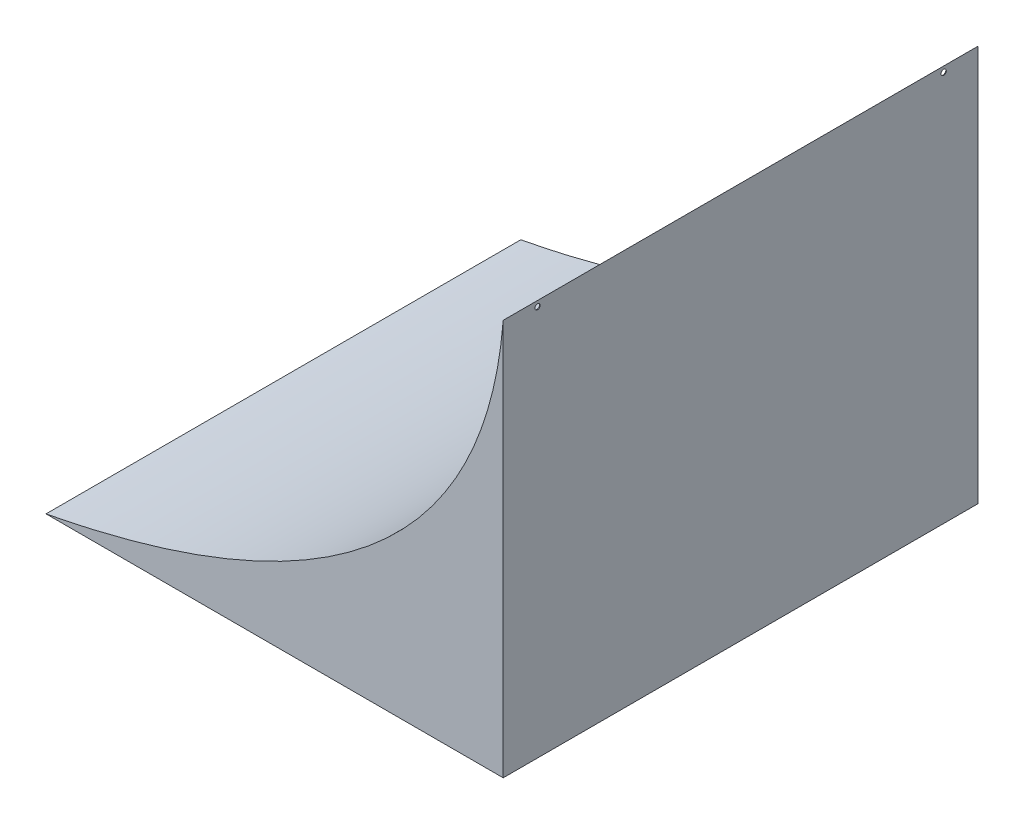
ISO-10303-21;
HEADER;
FILE_DESCRIPTION(('STEP AP214'),'2;1');
FILE_NAME('part.step','',(''),(''),'','','');
FILE_SCHEMA(('AUTOMOTIVE_DESIGN { 1 0 10303 214 1 1 1 1 }'));
ENDSEC;
DATA;
#1=APPLICATION_CONTEXT('core data for automotive mechanical design processes');
#2=APPLICATION_PROTOCOL_DEFINITION('international standard','automotive_design',2000,#1);
#3=PRODUCT_CONTEXT('',#1,'mechanical');
#4=PRODUCT('Part','Part','',(#3));
#5=PRODUCT_RELATED_PRODUCT_CATEGORY('part','',(#4));
#6=PRODUCT_DEFINITION_FORMATION('','',#4);
#7=PRODUCT_DEFINITION_CONTEXT('part definition',#1,'design');
#8=PRODUCT_DEFINITION('design','',#6,#7);
#9=PRODUCT_DEFINITION_SHAPE('','',#8);
#10=(LENGTH_UNIT() NAMED_UNIT(*) SI_UNIT(.MILLI.,.METRE.));
#11=(NAMED_UNIT(*) PLANE_ANGLE_UNIT() SI_UNIT($,.RADIAN.));
#12=(NAMED_UNIT(*) SI_UNIT($,.STERADIAN.) SOLID_ANGLE_UNIT());
#13=UNCERTAINTY_MEASURE_WITH_UNIT(LENGTH_MEASURE(1.E-05),#10,'distance_accuracy_value','');
#14=(GEOMETRIC_REPRESENTATION_CONTEXT(3) GLOBAL_UNCERTAINTY_ASSIGNED_CONTEXT((#13)) GLOBAL_UNIT_ASSIGNED_CONTEXT((#10,
#11,#12)) REPRESENTATION_CONTEXT('',''));
#15=CARTESIAN_POINT('',(0.,0.,0.));
#16=DIRECTION('',(0.,0.,1.));
#17=DIRECTION('',(1.,0.,0.));
#18=AXIS2_PLACEMENT_3D('',#15,#16,#17);
#19=CARTESIAN_POINT('',(100.713061676233,-109.438674176113,270.));
#20=DIRECTION('',(0.,1.,0.));
#21=DIRECTION('',(-1.,0.,0.));
#22=AXIS2_PLACEMENT_3D('',#19,#20,#21);
#23=PLANE('',#22);
#24=DIRECTION('',(1.,0.,0.));
#25=VECTOR('',#24,1.);
#26=CARTESIAN_POINT('',(100.713061676233,-109.438674176113,0.));
#27=LINE('',#26,#25);
#28=CARTESIAN_POINT('',(-159.286938330086,-109.438674177324,0.));
#29=VERTEX_POINT('',#28);
#30=CARTESIAN_POINT('',(100.713061676233,-109.438674176113,0.));
#31=VERTEX_POINT('',#30);
#32=EDGE_CURVE('E86',#29,#31,#27,.T.);
#33=ORIENTED_EDGE('',*,*,#32,.T.);
#34=DIRECTION('',(0.,0.,-1.));
#35=VECTOR('',#34,1.);
#36=CARTESIAN_POINT('',(100.713061676233,-109.438674176113,270.));
#37=LINE('',#36,#35);
#38=CARTESIAN_POINT('',(100.713061676233,-109.438674176113,270.));
#39=VERTEX_POINT('',#38);
#40=EDGE_CURVE('E11',#39,#31,#37,.T.);
#41=ORIENTED_EDGE('',*,*,#40,.F.);
#42=DIRECTION('',(1.,0.,0.));
#43=VECTOR('',#42,1.);
#44=CARTESIAN_POINT('',(100.713061676233,-109.438674176113,270.));
#45=LINE('',#44,#43);
#46=CARTESIAN_POINT('',(-159.286938330086,-109.438674177324,270.));
#47=VERTEX_POINT('',#46);
#48=EDGE_CURVE('E79',#47,#39,#45,.T.);
#49=ORIENTED_EDGE('',*,*,#48,.F.);
#50=DIRECTION('',(0.,0.,-1.));
#51=VECTOR('',#50,1.);
#52=CARTESIAN_POINT('',(-159.286938330086,-109.438674177324,270.));
#53=LINE('',#52,#51);
#54=EDGE_CURVE('E87',#47,#29,#53,.T.);
#55=ORIENTED_EDGE('',*,*,#54,.T.);
#56=EDGE_LOOP('',(#33,#41,#49,#55));
#57=FACE_BOUND('',#56,.T.);
#58=ADVANCED_FACE('F33',(#57),#23,.F.);
#59=CARTESIAN_POINT('',(100.713061676234,115.894152268828,270.));
#60=DIRECTION('',(-1.,0.,0.));
#61=DIRECTION('',(0.,-1.,0.));
#62=AXIS2_PLACEMENT_3D('',#59,#60,#61);
#63=PLANE('',#62);
#64=CARTESIAN_POINT('',(100.713061676234,112.769152268828,19.525));
#65=DIRECTION('',(-1.,0.,0.));
#66=DIRECTION('',(0.,-1.,0.));
#67=AXIS2_PLACEMENT_3D('',#64,#65,#66);
#68=CIRCLE('',#67,1.5);
#69=CARTESIAN_POINT('',(100.713061676234,111.269152268828,19.525));
#70=VERTEX_POINT('',#69);
#71=EDGE_CURVE('E111',#70,#70,#68,.T.);
#72=ORIENTED_EDGE('',*,*,#71,.T.);
#73=EDGE_LOOP('',(#72));
#74=FACE_BOUND('',#73,.T.);
#75=CARTESIAN_POINT('',(100.713061676234,112.769152268828,250.475));
#76=DIRECTION('',(-1.,0.,0.));
#77=DIRECTION('',(0.,-1.,0.));
#78=AXIS2_PLACEMENT_3D('',#75,#76,#77);
#79=CIRCLE('',#78,1.50000000000003);
#80=CARTESIAN_POINT('',(100.713061676234,111.269152268828,250.475));
#81=VERTEX_POINT('',#80);
#82=EDGE_CURVE('E89',#81,#81,#79,.T.);
#83=ORIENTED_EDGE('',*,*,#82,.T.);
#84=EDGE_LOOP('',(#83));
#85=FACE_BOUND('',#84,.T.);
#86=DIRECTION('',(0.,1.,0.));
#87=VECTOR('',#86,1.);
#88=CARTESIAN_POINT('',(100.713061676234,115.894152268828,0.));
#89=LINE('',#88,#87);
#90=CARTESIAN_POINT('',(100.713061676234,115.894152268828,0.));
#91=VERTEX_POINT('',#90);
#92=EDGE_CURVE('E67',#31,#91,#89,.T.);
#93=ORIENTED_EDGE('',*,*,#92,.T.);
#94=DIRECTION('',(0.,0.,-1.));
#95=VECTOR('',#94,1.);
#96=CARTESIAN_POINT('',(100.713061676234,115.894152268828,270.));
#97=LINE('',#96,#95);
#98=CARTESIAN_POINT('',(100.713061676234,115.894152268828,270.));
#99=VERTEX_POINT('',#98);
#100=EDGE_CURVE('E46',#99,#91,#97,.T.);
#101=ORIENTED_EDGE('',*,*,#100,.F.);
#102=DIRECTION('',(0.,1.,0.));
#103=VECTOR('',#102,1.);
#104=CARTESIAN_POINT('',(100.713061676234,115.894152268828,270.));
#105=LINE('',#104,#103);
#106=EDGE_CURVE('E75',#39,#99,#105,.T.);
#107=ORIENTED_EDGE('',*,*,#106,.F.);
#108=ORIENTED_EDGE('',*,*,#40,.T.);
#109=EDGE_LOOP('',(#93,#101,#107,#108));
#110=FACE_BOUND('',#109,.T.);
#111=ADVANCED_FACE('F76',(#74,#85,#110),#63,.F.);
#112=CARTESIAN_POINT('',(-859223.750456089,511886.914744761,270.));
#113=CARTESIAN_POINT('',(869202.032582094,-494561.987077249,270.));
#114=CARTESIAN_POINT('',(-878885.163617982,477336.276081629,270.));
#115=B_SPLINE_CURVE_WITH_KNOTS('',2,(#112,#113,#114),.UNSPECIFIED.,.F.,.F.,(3,3),(0.,1.),.UNSPECIFIED.);
#116=DIRECTION('',(0.,0.,-1.));
#117=VECTOR('',#116,1.);
#118=SURFACE_OF_LINEAR_EXTRUSION('',#115,#117);
#119=CARTESIAN_POINT('',(100.578599245267,114.269152268839,19.525));
#120=CARTESIAN_POINT('',(100.578598789128,114.269146462803,19.6090331655145));
#121=CARTESIAN_POINT('',(100.577990423994,114.262056893266,19.6931541265669));
#122=CARTESIAN_POINT('',(100.576178271082,114.240969573696,19.817459697587));
#123=CARTESIAN_POINT('',(100.575423287803,114.232186700241,19.8586155175117));
#124=CARTESIAN_POINT('',(100.573617059038,114.211192139653,19.9400788777361));
#125=CARTESIAN_POINT('',(100.572565555043,114.198977460696,19.9803856447297));
#126=CARTESIAN_POINT('',(100.56897809387,114.157346564526,20.0994275726801));
#127=CARTESIAN_POINT('',(100.566006708122,114.122914515263,20.1764539646627));
#128=CARTESIAN_POINT('',(100.558972621463,114.041660485885,20.3236161897094));
#129=CARTESIAN_POINT('',(100.554909876868,113.994838009808,20.393751746795));
#130=CARTESIAN_POINT('',(100.548072301239,113.916340144463,20.4923344417165));
#131=CARTESIAN_POINT('',(100.545665196198,113.888751132218,20.5241328823398));
#132=CARTESIAN_POINT('',(100.540620016853,113.831040986773,20.5852631294375));
#133=CARTESIAN_POINT('',(100.537982167213,113.800922317696,20.6145972818888));
#134=CARTESIAN_POINT('',(100.529740077152,113.707017232543,20.6986501493892));
#135=CARTESIAN_POINT('',(100.523805692056,113.639663289086,20.7494423902911));
#136=CARTESIAN_POINT('',(100.511195406021,113.497244880825,20.8391530046313));
#137=CARTESIAN_POINT('',(100.504516992292,113.422154355847,20.8780293688793));
#138=CARTESIAN_POINT('',(100.4906048774,113.266552277851,20.942633912228));
#139=CARTESIAN_POINT('',(100.483371165652,113.1860406215,20.9683618406255));
#140=CARTESIAN_POINT('',(100.468514405131,113.021579633891,21.0060212692264));
#141=CARTESIAN_POINT('',(100.46089003857,112.937618886354,21.0179023571556));
#142=CARTESIAN_POINT('',(100.445485887208,112.768908300997,21.0273774528326));
#143=CARTESIAN_POINT('',(100.437706100242,112.684158452194,21.0249712614119));
#144=CARTESIAN_POINT('',(100.422194706699,112.516076952163,21.0059194270052));
#145=CARTESIAN_POINT('',(100.41446324557,112.432748870191,20.9892421591162));
#146=CARTESIAN_POINT('',(100.399293547944,112.270070738051,20.9420708979327));
#147=CARTESIAN_POINT('',(100.39185531261,112.190720703675,20.9115768497919));
#148=CARTESIAN_POINT('',(100.37750055852,112.038286093239,20.8376340398727));
#149=CARTESIAN_POINT('',(100.370583865464,111.965199422827,20.794189630388));
#150=CARTESIAN_POINT('',(100.357486352711,111.827357884635,20.695557612315));
#151=CARTESIAN_POINT('',(100.351305522986,111.762602903315,20.6403701637842));
#152=CARTESIAN_POINT('',(100.339896558816,111.643475995335,20.5199885470918));
#153=CARTESIAN_POINT('',(100.334665622644,111.589073510303,20.4548248875062));
#154=CARTESIAN_POINT('',(100.325306370893,111.491990614543,20.3162124606294));
#155=CARTESIAN_POINT('',(100.321178028597,111.449309919791,20.242763894147));
#156=CARTESIAN_POINT('',(100.314178846929,111.377080414898,20.0900149232637));
#157=CARTESIAN_POINT('',(100.311302522865,111.347474320634,20.0107418571492));
#158=CARTESIAN_POINT('',(100.306878850599,111.301985330815,19.8483163752741));
#159=CARTESIAN_POINT('',(100.30533147102,111.286102111259,19.7651640511526));
#160=CARTESIAN_POINT('',(100.30362211693,111.268558113392,19.5976725041142));
#161=CARTESIAN_POINT('',(100.303455003607,111.266844580483,19.5133388557238));
#162=CARTESIAN_POINT('',(100.30449839788,111.277551290155,19.3455829049131));
#163=CARTESIAN_POINT('',(100.305708890832,111.28997138248,19.2621605928137));
#164=CARTESIAN_POINT('',(100.309463872347,111.328560215582,19.0986906643709));
#165=CARTESIAN_POINT('',(100.312006859,111.354713477183,19.0186393579487));
#166=CARTESIAN_POINT('',(100.318339816166,111.419999983463,18.8640713209856));
#167=CARTESIAN_POINT('',(100.322129795556,111.459133320531,18.7895546298433));
#168=CARTESIAN_POINT('',(100.330839424651,111.549345057679,18.6480001362242));
#169=CARTESIAN_POINT('',(100.335761373644,111.600447774228,18.5809779743637));
#170=CARTESIAN_POINT('',(100.346569509315,111.713089409119,18.4564589286828));
#171=CARTESIAN_POINT('',(100.352455716526,111.774628549699,18.3989622477538));
#172=CARTESIAN_POINT('',(100.365030772816,111.906669965072,18.2948695173523));
#173=CARTESIAN_POINT('',(100.371722855924,111.97720842682,18.2483197627865));
#174=CARTESIAN_POINT('',(100.385681011438,112.125044786228,18.1677180899699));
#175=CARTESIAN_POINT('',(100.392947096993,112.202342838736,18.1336664581167));
#176=CARTESIAN_POINT('',(100.407864577248,112.361854903681,18.0788846749098));
#177=CARTESIAN_POINT('',(100.415517460128,112.444088174017,18.0582109928228));
#178=CARTESIAN_POINT('',(100.430953911261,112.610848116283,18.0309858834494));
#179=CARTESIAN_POINT('',(100.438737481839,112.695374829037,18.0244347077118));
#180=CARTESIAN_POINT('',(100.454230530592,112.864532860755,18.0256430710494));
#181=CARTESIAN_POINT('',(100.461939796942,112.949163972551,18.0334355904844));
#182=CARTESIAN_POINT('',(100.477049824853,113.115919049147,18.0631757746117));
#183=CARTESIAN_POINT('',(100.484450585395,113.198043005661,18.0851234860824));
#184=CARTESIAN_POINT('',(100.49874418484,113.357454356142,18.1425868816178));
#185=CARTESIAN_POINT('',(100.505637243862,113.434743843917,18.1780966439427));
#186=CARTESIAN_POINT('',(100.515452126106,113.545301487347,18.2407129372598));
#187=CARTESIAN_POINT('',(100.518636823858,113.581263873697,18.2631484812716));
#188=CARTESIAN_POINT('',(100.524817310536,113.651210320344,18.3110104139278));
#189=CARTESIAN_POINT('',(100.527812912109,113.685192416118,18.3364396994311));
#190=CARTESIAN_POINT('',(100.536461312802,113.783505222286,18.4167485975668));
#191=CARTESIAN_POINT('',(100.541802963654,113.844509949313,18.4758238457524));
#192=CARTESIAN_POINT('',(100.551507569795,113.955713542597,18.6034598772519));
#193=CARTESIAN_POINT('',(100.555870576292,114.00591297423,18.6720201639628));
#194=CARTESIAN_POINT('',(100.561594736088,114.071941373921,18.7803332639038));
#195=CARTESIAN_POINT('',(100.563364831249,114.092391376334,18.8173137768955));
#196=CARTESIAN_POINT('',(100.566624195967,114.130090615742,18.8928386973843));
#197=CARTESIAN_POINT('',(100.568113711522,114.147342656352,18.9313816985862));
#198=CARTESIAN_POINT('',(100.572146635525,114.194095776987,19.0489484895883));
#199=CARTESIAN_POINT('',(100.574260886905,114.218668599233,19.1300328898839));
#200=CARTESIAN_POINT('',(100.576712260301,114.247180932208,19.2638555331608));
#201=CARTESIAN_POINT('',(100.577419008917,114.255408361973,19.3157295054205));
#202=CARTESIAN_POINT('',(100.578362643405,114.266395838315,19.420057568245));
#203=CARTESIAN_POINT('',(100.578599530178,114.269155895373,19.4725116576976));
#204=CARTESIAN_POINT('',(100.578599245267,114.269152268839,19.525));
#205=B_SPLINE_CURVE_WITH_KNOTS('',3,(#119,#120,#121,#122,#123,#124,#125,#126,#127,#128,#129,
#130,#131,#132,#133,#134,#135,#136,#137,#138,#139,#140,#141,#142,#143,#144,#145,#146,#147,#148,
#149,#150,#151,#152,#153,#154,#155,#156,#157,#158,#159,#160,#161,#162,#163,#164,#165,#166,#167,
#168,#169,#170,#171,#172,#173,#174,#175,#176,#177,#178,#179,#180,#181,#182,#183,#184,#185,#186,
#187,#188,#189,#190,#191,#192,#193,#194,#195,#196,#197,#198,#199,#200,#201,#202,#203,#204),
.UNSPECIFIED.,.T.,.F.,(4,2,2,2,2,2,2,2,2,2,2,2,2,2,2,2,2,2,2,2,2,2,2,2,2,2,2,2,2,2,2,2,2,2,2,2,
2,2,2,2,2,2,4),(0.,0.251874483281795,0.378020651190057,0.504277135512258,0.756280528764111,
1.00829401066199,1.1346651142123,1.26091451728474,1.51332558892595,1.76661655836236,
2.01991235715736,2.27412747887292,2.5283461444248,2.7831296252794,3.03791411751301,
3.29261307937688,3.5473085699192,3.80124017774236,4.05516563211988,4.30796724239601,
4.56076288379507,4.8126169260804,5.06446829088926,5.31603639186901,5.56760628348193,
5.81969175563901,6.07178259649356,6.32492109985922,6.57806540359319,6.83227139493909,
7.08648191414207,7.34127766811899,7.59607426411751,7.85075973257867,7.97814793333621,
8.10566042893076,8.35963522391185,8.61359672670066,8.74034807057382,8.86698776198297,
9.11984071309113,9.27716549499091,9.43448997532909),.UNSPECIFIED.);
#206=CARTESIAN_POINT('',(100.578599245267,114.269152268839,19.525));
#207=VERTEX_POINT('',#206);
#208=EDGE_CURVE('E36',#207,#207,#205,.T.);
#209=ORIENTED_EDGE('',*,*,#208,.T.);
#210=EDGE_LOOP('',(#209));
#211=FACE_BOUND('',#210,.T.);
#212=CARTESIAN_POINT('',(100.578599245267,114.269152268839,250.475));
#213=CARTESIAN_POINT('',(100.578598789128,114.269146462803,250.559033165515));
#214=CARTESIAN_POINT('',(100.577990423994,114.262056893266,250.643154126567));
#215=CARTESIAN_POINT('',(100.576178271082,114.240969573696,250.767459697587));
#216=CARTESIAN_POINT('',(100.575423287803,114.232186700241,250.808615517512));
#217=CARTESIAN_POINT('',(100.573617059038,114.211192139653,250.890078877736));
#218=CARTESIAN_POINT('',(100.572565555044,114.198977460696,250.93038564473));
#219=CARTESIAN_POINT('',(100.568978093869,114.157346564526,251.04942757268));
#220=CARTESIAN_POINT('',(100.566006708117,114.122914515264,251.126453964662));
#221=CARTESIAN_POINT('',(100.558972621468,114.041660485884,251.27361618971));
#222=CARTESIAN_POINT('',(100.554909876888,113.994838009807,251.343751746796));
#223=CARTESIAN_POINT('',(100.548072301229,113.916340144463,251.442334441716));
#224=CARTESIAN_POINT('',(100.54566519617,113.888751132219,251.474132882339));
#225=CARTESIAN_POINT('',(100.540620016824,113.831040986774,251.535263129436));
#226=CARTESIAN_POINT('',(100.537982167203,113.800922317696,251.564597281889));
#227=CARTESIAN_POINT('',(100.529740077172,113.707017232542,251.64865014939));
#228=CARTESIAN_POINT('',(100.523805692062,113.639663289086,251.699442390291));
#229=CARTESIAN_POINT('',(100.511195406015,113.497244880825,251.789153004631));
#230=CARTESIAN_POINT('',(100.504516992291,113.422154355847,251.828029368879));
#231=CARTESIAN_POINT('',(100.490604877401,113.266552277851,251.892633912228));
#232=CARTESIAN_POINT('',(100.483371165652,113.1860406215,251.918361840626));
#233=CARTESIAN_POINT('',(100.468514405131,113.021579633888,251.956021269227));
#234=CARTESIAN_POINT('',(100.460890038572,112.937618886348,251.967902357156));
#235=CARTESIAN_POINT('',(100.445485887205,112.768908300986,251.977377452833));
#236=CARTESIAN_POINT('',(100.437706100233,112.68415845218,251.974971261413));
#237=CARTESIAN_POINT('',(100.422194706709,112.516076952147,251.955919427004));
#238=CARTESIAN_POINT('',(100.414463245607,112.432748870176,251.939242159113));
#239=CARTESIAN_POINT('',(100.399293547964,112.270070738041,251.892070897929));
#240=CARTESIAN_POINT('',(100.391855312589,112.190720703671,251.86157684979));
#241=CARTESIAN_POINT('',(100.377500558484,112.038286093239,251.787634039872));
#242=CARTESIAN_POINT('',(100.370583865454,111.965199422825,251.744189630387));
#243=CARTESIAN_POINT('',(100.35748635272,111.827357884634,251.645557612314));
#244=CARTESIAN_POINT('',(100.351305522989,111.762602903314,251.590370163784));
#245=CARTESIAN_POINT('',(100.339896558813,111.643475995336,251.469988547092));
#246=CARTESIAN_POINT('',(100.334665622643,111.589073510303,251.404824887506));
#247=CARTESIAN_POINT('',(100.325306370893,111.491990614543,251.266212460629));
#248=CARTESIAN_POINT('',(100.321178028597,111.449309919791,251.192763894147));
#249=CARTESIAN_POINT('',(100.314178846929,111.377080414898,251.040014923264));
#250=CARTESIAN_POINT('',(100.311302522865,111.347474320634,250.960741857149));
#251=CARTESIAN_POINT('',(100.306878850599,111.301985330815,250.798316375274));
#252=CARTESIAN_POINT('',(100.30533147102,111.286102111259,250.715164051153));
#253=CARTESIAN_POINT('',(100.30362211693,111.268558113392,250.547672504114));
#254=CARTESIAN_POINT('',(100.303455003607,111.266844580483,250.463338855724));
#255=CARTESIAN_POINT('',(100.30449839788,111.277551290155,250.295582904913));
#256=CARTESIAN_POINT('',(100.305708890832,111.28997138248,250.212160592814));
#257=CARTESIAN_POINT('',(100.309463872347,111.328560215582,250.048690664371));
#258=CARTESIAN_POINT('',(100.312006859,111.354713477183,249.968639357949));
#259=CARTESIAN_POINT('',(100.318339816166,111.419999983463,249.814071320986));
#260=CARTESIAN_POINT('',(100.322129795556,111.459133320531,249.739554629843));
#261=CARTESIAN_POINT('',(100.330839424651,111.549345057679,249.598000136224));
#262=CARTESIAN_POINT('',(100.335761373644,111.600447774228,249.530977974364));
#263=CARTESIAN_POINT('',(100.346569509315,111.713089409119,249.406458928683));
#264=CARTESIAN_POINT('',(100.352455716526,111.774628549699,249.348962247754));
#265=CARTESIAN_POINT('',(100.365030772816,111.906669965072,249.244869517352));
#266=CARTESIAN_POINT('',(100.371722855924,111.97720842682,249.198319762786));
#267=CARTESIAN_POINT('',(100.385681011438,112.125044786228,249.11771808997));
#268=CARTESIAN_POINT('',(100.392947096993,112.202342838736,249.083666458117));
#269=CARTESIAN_POINT('',(100.407864577248,112.361854903681,249.02888467491));
#270=CARTESIAN_POINT('',(100.415517460128,112.444088174017,249.008210992823));
#271=CARTESIAN_POINT('',(100.430953911261,112.610848116283,248.980985883449));
#272=CARTESIAN_POINT('',(100.438737481839,112.695374829037,248.974434707712));
#273=CARTESIAN_POINT('',(100.454230530592,112.864532860755,248.975643071049));
#274=CARTESIAN_POINT('',(100.461939796942,112.949163972551,248.983435590484));
#275=CARTESIAN_POINT('',(100.477049824853,113.115919049147,249.013175774612));
#276=CARTESIAN_POINT('',(100.484450585395,113.198043005661,249.035123486082));
#277=CARTESIAN_POINT('',(100.49874418484,113.357454356142,249.092586881618));
#278=CARTESIAN_POINT('',(100.505637243862,113.434743843917,249.128096643943));
#279=CARTESIAN_POINT('',(100.515452126106,113.545301487347,249.19071293726));
#280=CARTESIAN_POINT('',(100.518636823858,113.581263873697,249.213148481272));
#281=CARTESIAN_POINT('',(100.524817310536,113.651210320344,249.261010413928));
#282=CARTESIAN_POINT('',(100.527812912109,113.685192416118,249.286439699431));
#283=CARTESIAN_POINT('',(100.536461312802,113.783505222286,249.366748597567));
#284=CARTESIAN_POINT('',(100.541802963654,113.844509949313,249.425823845752));
#285=CARTESIAN_POINT('',(100.551507569795,113.955713542597,249.553459877252));
#286=CARTESIAN_POINT('',(100.555870576292,114.00591297423,249.622020163963));
#287=CARTESIAN_POINT('',(100.561594736088,114.071941373921,249.730333263904));
#288=CARTESIAN_POINT('',(100.563364831249,114.092391376334,249.767313776896));
#289=CARTESIAN_POINT('',(100.566624195967,114.130090615742,249.842838697384));
#290=CARTESIAN_POINT('',(100.568113711522,114.147342656352,249.881381698586));
#291=CARTESIAN_POINT('',(100.572146635525,114.194095776987,249.998948489588));
#292=CARTESIAN_POINT('',(100.574260886905,114.218668599233,250.080032889884));
#293=CARTESIAN_POINT('',(100.576712260301,114.247180932208,250.213855533161));
#294=CARTESIAN_POINT('',(100.577419008917,114.255408361973,250.265729505421));
#295=CARTESIAN_POINT('',(100.578362643405,114.266395838315,250.370057568245));
#296=CARTESIAN_POINT('',(100.578599530178,114.269155895373,250.422511657698));
#297=CARTESIAN_POINT('',(100.578599245267,114.269152268839,250.475));
#298=B_SPLINE_CURVE_WITH_KNOTS('',3,(#212,#213,#214,#215,#216,#217,#218,#219,#220,#221,#222,
#223,#224,#225,#226,#227,#228,#229,#230,#231,#232,#233,#234,#235,#236,#237,#238,#239,#240,#241,
#242,#243,#244,#245,#246,#247,#248,#249,#250,#251,#252,#253,#254,#255,#256,#257,#258,#259,#260,
#261,#262,#263,#264,#265,#266,#267,#268,#269,#270,#271,#272,#273,#274,#275,#276,#277,#278,#279,
#280,#281,#282,#283,#284,#285,#286,#287,#288,#289,#290,#291,#292,#293,#294,#295,#296,#297),
.UNSPECIFIED.,.T.,.F.,(4,2,2,2,2,2,2,2,2,2,2,2,2,2,2,2,2,2,2,2,2,2,2,2,2,2,2,2,2,2,2,2,2,2,2,2,
2,2,2,2,2,2,4),(0.,0.251874483281837,0.378020651190091,0.504277135512339,0.756280528764196,
1.00829401066212,1.13466511421233,1.26091451728472,1.51332558892586,1.76661655836219,
2.01991235715729,2.27412747888134,2.52834614444148,2.78312962528957,3.03791411751683,
3.29261307937893,3.54730856991942,3.80124017774261,4.05516563212012,4.3079672423963,
4.56076288379539,4.81261692608073,5.06446829088959,5.31603639186928,5.56760628348221,
5.81969175563929,6.07178259649383,6.32492109985949,6.57806540359347,6.83227139493938,
7.08648191414235,7.34127766811927,7.59607426411779,7.85075973257896,7.9781479333365,
8.10566042893106,8.35963522391217,8.61359672670097,8.74034807057414,8.86698776198328,
9.11984071309147,9.27716549499122,9.43448997532939),.UNSPECIFIED.);
#299=CARTESIAN_POINT('',(100.578599245267,114.269152268839,250.475));
#300=VERTEX_POINT('',#299);
#301=EDGE_CURVE('E93',#300,#300,#298,.T.);
#302=ORIENTED_EDGE('',*,*,#301,.T.);
#303=EDGE_LOOP('',(#302));
#304=FACE_BOUND('',#303,.T.);
#305=CARTESIAN_POINT('',(-859223.750456089,511886.914744761,0.));
#306=CARTESIAN_POINT('',(869202.032582094,-494561.987077249,0.));
#307=CARTESIAN_POINT('',(-878885.163617982,477336.276081629,0.));
#308=B_SPLINE_CURVE_WITH_KNOTS('',2,(#305,#306,#307),.UNSPECIFIED.,.F.,.F.,(3,3),(0.,1.),.UNSPECIFIED.);
#309=EDGE_CURVE('E72',#91,#29,#308,.T.);
#310=ORIENTED_EDGE('',*,*,#309,.T.);
#311=ORIENTED_EDGE('',*,*,#54,.F.);
#312=EDGE_CURVE('E55',#99,#47,#115,.T.);
#313=ORIENTED_EDGE('',*,*,#312,.F.);
#314=ORIENTED_EDGE('',*,*,#100,.T.);
#315=EDGE_LOOP('',(#310,#311,#313,#314));
#316=FACE_BOUND('',#315,.T.);
#317=ADVANCED_FACE('F112',(#211,#304,#316),#118,.F.);
#318=CARTESIAN_POINT('',(73.7877725293856,24.8041679729312,270.));
#319=DIRECTION('',(0.,0.,1.));
#320=DIRECTION('',(1.,0.,0.));
#321=AXIS2_PLACEMENT_3D('',#318,#319,#320);
#322=PLANE('',#321);
#323=ORIENTED_EDGE('',*,*,#48,.T.);
#324=ORIENTED_EDGE('',*,*,#106,.T.);
#325=ORIENTED_EDGE('',*,*,#312,.T.);
#326=EDGE_LOOP('',(#323,#324,#325));
#327=FACE_BOUND('',#326,.T.);
#328=ADVANCED_FACE('F82',(#327),#322,.T.);
#329=CARTESIAN_POINT('',(73.7877725293856,24.8041679729312,0.));
#330=DIRECTION('',(0.,0.,1.));
#331=DIRECTION('',(1.,0.,0.));
#332=AXIS2_PLACEMENT_3D('',#329,#330,#331);
#333=PLANE('',#332);
#334=ORIENTED_EDGE('',*,*,#32,.F.);
#335=ORIENTED_EDGE('',*,*,#309,.F.);
#336=ORIENTED_EDGE('',*,*,#92,.F.);
#337=EDGE_LOOP('',(#334,#335,#336));
#338=FACE_BOUND('',#337,.T.);
#339=ADVANCED_FACE('F120',(#338),#333,.F.);
#340=CARTESIAN_POINT('',(80.6630616762344,112.769152268828,250.475));
#341=DIRECTION('',(1.,0.,0.));
#342=DIRECTION('',(0.,1.,0.));
#343=AXIS2_PLACEMENT_3D('',#340,#341,#342);
#344=CYLINDRICAL_SURFACE('',#343,1.50000000000003);
#345=ORIENTED_EDGE('',*,*,#301,.F.);
#346=EDGE_LOOP('',(#345));
#347=FACE_BOUND('',#346,.T.);
#348=ORIENTED_EDGE('',*,*,#82,.F.);
#349=EDGE_LOOP('',(#348));
#350=FACE_BOUND('',#349,.T.);
#351=ADVANCED_FACE('F115',(#347,#350),#344,.F.);
#352=CARTESIAN_POINT('',(80.6630616762344,112.769152268828,19.525));
#353=DIRECTION('',(1.,0.,0.));
#354=DIRECTION('',(0.,1.,0.));
#355=AXIS2_PLACEMENT_3D('',#352,#353,#354);
#356=CYLINDRICAL_SURFACE('',#355,1.5);
#357=ORIENTED_EDGE('',*,*,#208,.F.);
#358=EDGE_LOOP('',(#357));
#359=FACE_BOUND('',#358,.T.);
#360=ORIENTED_EDGE('',*,*,#71,.F.);
#361=EDGE_LOOP('',(#360));
#362=FACE_BOUND('',#361,.T.);
#363=ADVANCED_FACE('F119',(#359,#362),#356,.F.);
#364=CLOSED_SHELL('',(#58,#111,#317,#328,#339,#351,#363));
#365=MANIFOLD_SOLID_BREP('B2',#364);
#366=ADVANCED_BREP_SHAPE_REPRESENTATION('',(#18,#365),#14);
#367=SHAPE_DEFINITION_REPRESENTATION(#9,#366);
ENDSEC;
END-ISO-10303-21;
